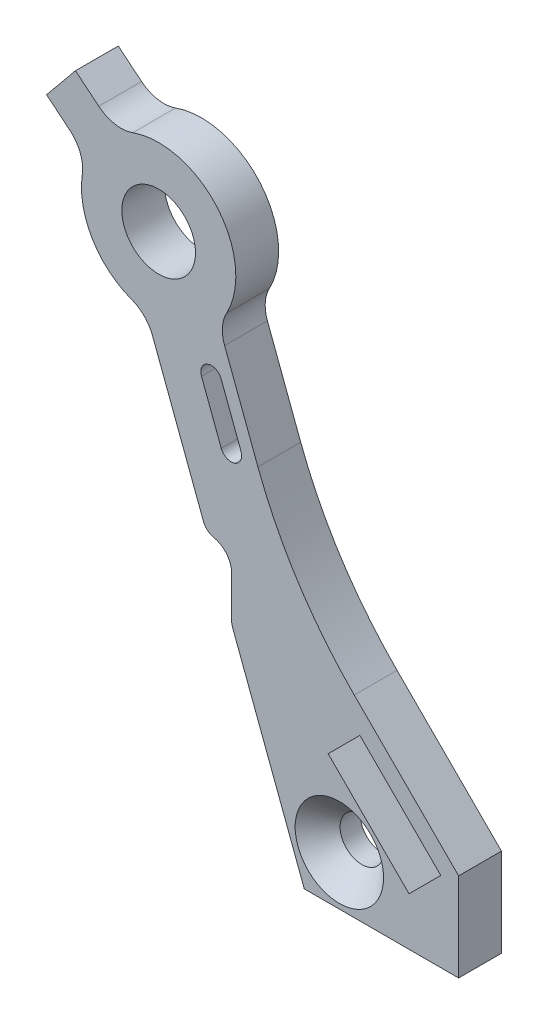
ISO-10303-21;
HEADER;
FILE_DESCRIPTION(('STEP AP214'),'2;1');
FILE_NAME('part.step','',(''),(''),'','','');
FILE_SCHEMA(('AUTOMOTIVE_DESIGN { 1 0 10303 214 1 1 1 1 }'));
ENDSEC;
DATA;
#1=APPLICATION_CONTEXT('core data for automotive mechanical design processes');
#2=APPLICATION_PROTOCOL_DEFINITION('international standard','automotive_design',2000,#1);
#3=PRODUCT_CONTEXT('',#1,'mechanical');
#4=PRODUCT('Part','Part','',(#3));
#5=PRODUCT_RELATED_PRODUCT_CATEGORY('part','',(#4));
#6=PRODUCT_DEFINITION_FORMATION('','',#4);
#7=PRODUCT_DEFINITION_CONTEXT('part definition',#1,'design');
#8=PRODUCT_DEFINITION('design','',#6,#7);
#9=PRODUCT_DEFINITION_SHAPE('','',#8);
#10=(LENGTH_UNIT() NAMED_UNIT(*) SI_UNIT(.MILLI.,.METRE.));
#11=(NAMED_UNIT(*) PLANE_ANGLE_UNIT() SI_UNIT($,.RADIAN.));
#12=(NAMED_UNIT(*) SI_UNIT($,.STERADIAN.) SOLID_ANGLE_UNIT());
#13=UNCERTAINTY_MEASURE_WITH_UNIT(LENGTH_MEASURE(1.E-05),#10,'distance_accuracy_value','');
#14=(GEOMETRIC_REPRESENTATION_CONTEXT(3) GLOBAL_UNCERTAINTY_ASSIGNED_CONTEXT((#13)) GLOBAL_UNIT_ASSIGNED_CONTEXT((#10,
#11,#12)) REPRESENTATION_CONTEXT('',''));
#15=CARTESIAN_POINT('',(0.,0.,0.));
#16=DIRECTION('',(0.,0.,1.));
#17=DIRECTION('',(1.,0.,0.));
#18=AXIS2_PLACEMENT_3D('',#15,#16,#17);
#19=CARTESIAN_POINT('',(4.21153120532065,1.58524600823039,3.05));
#20=DIRECTION('',(-0.935895823404589,-0.352276890717865,0.));
#21=DIRECTION('',(0.352276890717865,-0.935895823404589,0.));
#22=AXIS2_PLACEMENT_3D('',#19,#20,#21);
#23=PLANE('',#22);
#24=DIRECTION('',(-0.352276890717865,0.935895823404589,0.));
#25=VECTOR('',#24,1.);
#26=CARTESIAN_POINT('',(4.21153120532065,1.58524600823039,0.));
#27=LINE('',#26,#25);
#28=CARTESIAN_POINT('',(-4.51071856128028,24.7576917244929,0.));
#29=VERTEX_POINT('',#28);
#30=CARTESIAN_POINT('',(-5.91982612415175,28.5012750181112,0.));
#31=VERTEX_POINT('',#30);
#32=EDGE_CURVE('E421',#29,#31,#27,.T.);
#33=ORIENTED_EDGE('',*,*,#32,.F.);
#34=DIRECTION('',(0.,0.,-1.));
#35=VECTOR('',#34,1.);
#36=CARTESIAN_POINT('',(-4.51071856128028,24.7576917244929,3.05));
#37=LINE('',#36,#35);
#38=CARTESIAN_POINT('',(-4.51071856128028,24.7576917244929,3.05));
#39=VERTEX_POINT('',#38);
#40=EDGE_CURVE('E492',#29,#39,#37,.F.);
#41=ORIENTED_EDGE('',*,*,#40,.T.);
#42=DIRECTION('',(-0.352276890717865,0.935895823404589,0.));
#43=VECTOR('',#42,1.);
#44=CARTESIAN_POINT('',(4.21153120532065,1.58524600823039,3.05));
#45=LINE('',#44,#43);
#46=CARTESIAN_POINT('',(-5.91982612415175,28.5012750181112,3.05));
#47=VERTEX_POINT('',#46);
#48=EDGE_CURVE('E324',#39,#47,#45,.T.);
#49=ORIENTED_EDGE('',*,*,#48,.T.);
#50=DIRECTION('',(0.,0.,-1.));
#51=VECTOR('',#50,1.);
#52=CARTESIAN_POINT('',(-5.91982612415175,28.5012750181112,0.));
#53=LINE('',#52,#51);
#54=EDGE_CURVE('E499',#47,#31,#53,.T.);
#55=ORIENTED_EDGE('',*,*,#54,.T.);
#56=EDGE_LOOP('',(#33,#41,#49,#55));
#57=FACE_BOUND('',#56,.T.);
#58=ADVANCED_FACE('F52',(#57),#23,.T.);
#59=CARTESIAN_POINT('',(7.70970869120796,7.70970869120796,3.05));
#60=DIRECTION('',(0.707106781186548,0.707106781186547,0.));
#61=DIRECTION('',(-0.707106781186547,0.707106781186548,0.));
#62=AXIS2_PLACEMENT_3D('',#59,#60,#61);
#63=PLANE('',#62);
#64=DIRECTION('',(0.707106781186547,-0.707106781186548,0.));
#65=VECTOR('',#64,1.);
#66=CARTESIAN_POINT('',(7.70970869120796,7.70970869120796,0.));
#67=LINE('',#66,#65);
#68=CARTESIAN_POINT('',(3.96428752719385,11.4551298552221,0.));
#69=VERTEX_POINT('',#68);
#70=CARTESIAN_POINT('',(9.72720779386421,5.6922095885517,0.));
#71=VERTEX_POINT('',#70);
#72=EDGE_CURVE('E400',#69,#71,#67,.T.);
#73=ORIENTED_EDGE('',*,*,#72,.T.);
#74=DIRECTION('',(0.,0.,-1.));
#75=VECTOR('',#74,1.);
#76=CARTESIAN_POINT('',(9.72720779386421,5.6922095885517,3.05));
#77=LINE('',#76,#75);
#78=CARTESIAN_POINT('',(9.72720779386421,5.6922095885517,3.05));
#79=VERTEX_POINT('',#78);
#80=EDGE_CURVE('E648',#79,#71,#77,.T.);
#81=ORIENTED_EDGE('',*,*,#80,.F.);
#82=DIRECTION('',(0.707106781186547,-0.707106781186548,0.));
#83=VECTOR('',#82,1.);
#84=CARTESIAN_POINT('',(7.70970869120796,7.70970869120796,3.05));
#85=LINE('',#84,#83);
#86=CARTESIAN_POINT('',(3.96428752719385,11.4551298552221,3.05));
#87=VERTEX_POINT('',#86);
#88=EDGE_CURVE('E311',#87,#79,#85,.T.);
#89=ORIENTED_EDGE('',*,*,#88,.F.);
#90=DIRECTION('',(0.,0.,-1.));
#91=VECTOR('',#90,1.);
#92=CARTESIAN_POINT('',(3.96428752719385,11.4551298552221,3.05));
#93=LINE('',#92,#91);
#94=EDGE_CURVE('E264',#87,#69,#93,.T.);
#95=ORIENTED_EDGE('',*,*,#94,.T.);
#96=EDGE_LOOP('',(#73,#81,#89,#95));
#97=FACE_BOUND('',#96,.T.);
#98=ADVANCED_FACE('F646',(#97),#63,.F.);
#99=CARTESIAN_POINT('',(2.01749910265625,-2.01749910265625,3.05));
#100=DIRECTION('',(-0.707106781186547,0.707106781186548,0.));
#101=DIRECTION('',(-0.707106781186548,-0.707106781186547,0.));
#102=AXIS2_PLACEMENT_3D('',#99,#100,#101);
#103=PLANE('',#102);
#104=DIRECTION('',(0.707106781186548,0.707106781186547,0.));
#105=VECTOR('',#104,1.);
#106=CARTESIAN_POINT('',(2.01749910265625,-2.01749910265625,0.));
#107=LINE('',#106,#105);
#108=CARTESIAN_POINT('',(7.46446609406726,3.42946788875475,0.));
#109=VERTEX_POINT('',#108);
#110=EDGE_CURVE('E408',#109,#71,#107,.T.);
#111=ORIENTED_EDGE('',*,*,#110,.F.);
#112=DIRECTION('',(0.,0.,-1.));
#113=VECTOR('',#112,1.);
#114=CARTESIAN_POINT('',(7.46446609406726,3.42946788875475,3.05));
#115=LINE('',#114,#113);
#116=CARTESIAN_POINT('',(7.46446609406726,3.42946788875475,3.05));
#117=VERTEX_POINT('',#116);
#118=EDGE_CURVE('E656',#117,#109,#115,.T.);
#119=ORIENTED_EDGE('',*,*,#118,.F.);
#120=DIRECTION('',(0.707106781186548,0.707106781186547,0.));
#121=VECTOR('',#120,1.);
#122=CARTESIAN_POINT('',(2.01749910265625,-2.01749910265625,3.05));
#123=LINE('',#122,#121);
#124=EDGE_CURVE('E314',#117,#79,#123,.T.);
#125=ORIENTED_EDGE('',*,*,#124,.T.);
#126=ORIENTED_EDGE('',*,*,#80,.T.);
#127=EDGE_LOOP('',(#111,#119,#125,#126));
#128=FACE_BOUND('',#127,.T.);
#129=ADVANCED_FACE('F746',(#128),#103,.T.);
#130=CARTESIAN_POINT('',(5.44696699141101,5.44696699141101,3.05));
#131=DIRECTION('',(-0.707106781186548,-0.707106781186548,0.));
#132=DIRECTION('',(0.707106781186548,-0.707106781186548,0.));
#133=AXIS2_PLACEMENT_3D('',#130,#131,#132);
#134=PLANE('',#133);
#135=DIRECTION('',(-0.707106781186548,0.707106781186548,0.));
#136=VECTOR('',#135,1.);
#137=CARTESIAN_POINT('',(5.44696699141101,5.44696699141101,0.));
#138=LINE('',#137,#136);
#139=CARTESIAN_POINT('',(1.70154582739689,9.19238815542512,0.));
#140=VERTEX_POINT('',#139);
#141=EDGE_CURVE('E422',#109,#140,#138,.T.);
#142=ORIENTED_EDGE('',*,*,#141,.T.);
#143=DIRECTION('',(0.,0.,-1.));
#144=VECTOR('',#143,1.);
#145=CARTESIAN_POINT('',(1.70154582739689,9.19238815542512,3.05));
#146=LINE('',#145,#144);
#147=CARTESIAN_POINT('',(1.70154582739689,9.19238815542512,3.05));
#148=VERTEX_POINT('',#147);
#149=EDGE_CURVE('E653',#148,#140,#146,.T.);
#150=ORIENTED_EDGE('',*,*,#149,.F.);
#151=DIRECTION('',(-0.707106781186548,0.707106781186548,0.));
#152=VECTOR('',#151,1.);
#153=CARTESIAN_POINT('',(5.44696699141101,5.44696699141101,3.05));
#154=LINE('',#153,#152);
#155=EDGE_CURVE('E318',#117,#148,#154,.T.);
#156=ORIENTED_EDGE('',*,*,#155,.F.);
#157=ORIENTED_EDGE('',*,*,#118,.T.);
#158=EDGE_LOOP('',(#142,#150,#156,#157));
#159=FACE_BOUND('',#158,.T.);
#160=ADVANCED_FACE('F755',(#159),#134,.F.);
#161=CARTESIAN_POINT('',(-10.3758589408527,35.3719570465917,3.05));
#162=DIRECTION('',(0.,0.,-1.));
#163=DIRECTION('',(-1.,0.,0.));
#164=AXIS2_PLACEMENT_3D('',#161,#162,#163);
#165=CYLINDRICAL_SURFACE('',#164,5.5);
#166=CARTESIAN_POINT('',(-10.3758589408527,35.3719570465917,0.));
#167=DIRECTION('',(0.,0.,1.));
#168=DIRECTION('',(1.,0.,0.));
#169=AXIS2_PLACEMENT_3D('',#166,#167,#168);
#170=CIRCLE('',#169,5.5);
#171=CARTESIAN_POINT('',(-5.5359145871191,32.759498692328,0.));
#172=VERTEX_POINT('',#171);
#173=CARTESIAN_POINT('',(-12.2197033977444,40.5536785384117,0.));
#174=VERTEX_POINT('',#173);
#175=EDGE_CURVE('E338',#172,#174,#170,.T.);
#176=ORIENTED_EDGE('',*,*,#175,.T.);
#177=DIRECTION('',(0.,0.,-1.));
#178=VECTOR('',#177,1.);
#179=CARTESIAN_POINT('',(-12.2197033977444,40.5536785384117,3.05));
#180=LINE('',#179,#178);
#181=CARTESIAN_POINT('',(-12.2197033977444,40.5536785384117,3.05));
#182=VERTEX_POINT('',#181);
#183=EDGE_CURVE('E556',#174,#182,#180,.F.);
#184=ORIENTED_EDGE('',*,*,#183,.T.);
#185=CARTESIAN_POINT('',(-10.3758589408527,35.3719570465917,3.05));
#186=DIRECTION('',(0.,0.,1.));
#187=DIRECTION('',(1.,0.,0.));
#188=AXIS2_PLACEMENT_3D('',#185,#186,#187);
#189=CIRCLE('',#188,5.5);
#190=CARTESIAN_POINT('',(-5.5359145871191,32.759498692328,3.05));
#191=VERTEX_POINT('',#190);
#192=EDGE_CURVE('E278',#191,#182,#189,.T.);
#193=ORIENTED_EDGE('',*,*,#192,.F.);
#194=DIRECTION('',(0.,0.,-1.));
#195=VECTOR('',#194,1.);
#196=CARTESIAN_POINT('',(-5.5359145871191,32.759498692328,3.05));
#197=LINE('',#196,#195);
#198=EDGE_CURVE('E553',#191,#172,#197,.T.);
#199=ORIENTED_EDGE('',*,*,#198,.T.);
#200=EDGE_LOOP('',(#176,#184,#193,#199));
#201=FACE_BOUND('',#200,.T.);
#202=ADVANCED_FACE('F552',(#201),#165,.T.);
#203=CARTESIAN_POINT('',(14.2012797471101,17.3053215396913,3.05));
#204=DIRECTION('',(0.634371113005199,0.773028648230158,0.));
#205=DIRECTION('',(-0.773028648230158,0.634371113005199,0.));
#206=AXIS2_PLACEMENT_3D('',#203,#204,#205);
#207=PLANE('',#206);
#208=DIRECTION('',(0.773028648230158,-0.634371113005199,0.));
#209=VECTOR('',#208,1.);
#210=CARTESIAN_POINT('',(14.2012797471101,17.3053215396913,3.05));
#211=LINE('',#210,#209);
#212=CARTESIAN_POINT('',(-16.3022637162907,42.3374686170124,3.05));
#213=VERTEX_POINT('',#212);
#214=CARTESIAN_POINT('',(-14.6437422970263,40.9764348686636,3.05));
#215=VERTEX_POINT('',#214);
#216=EDGE_CURVE('E255',#213,#215,#211,.T.);
#217=ORIENTED_EDGE('',*,*,#216,.T.);
#218=DIRECTION('',(0.,0.,-1.));
#219=VECTOR('',#218,1.);
#220=CARTESIAN_POINT('',(-14.6437422970263,40.9764348686636,3.05));
#221=LINE('',#220,#219);
#222=CARTESIAN_POINT('',(-14.6437422970263,40.9764348686636,0.));
#223=VERTEX_POINT('',#222);
#224=EDGE_CURVE('E560',#215,#223,#221,.T.);
#225=ORIENTED_EDGE('',*,*,#224,.T.);
#226=DIRECTION('',(0.773028648230158,-0.634371113005199,0.));
#227=VECTOR('',#226,1.);
#228=CARTESIAN_POINT('',(14.2012797471101,17.3053215396913,0.));
#229=LINE('',#228,#227);
#230=CARTESIAN_POINT('',(-16.3022637162907,42.3374686170124,0.));
#231=VERTEX_POINT('',#230);
#232=EDGE_CURVE('E258',#231,#223,#229,.T.);
#233=ORIENTED_EDGE('',*,*,#232,.F.);
#234=DIRECTION('',(0.,0.,-1.));
#235=VECTOR('',#234,1.);
#236=CARTESIAN_POINT('',(-16.3022637162907,42.3374686170124,3.05));
#237=LINE('',#236,#235);
#238=EDGE_CURVE('E251',#213,#231,#237,.T.);
#239=ORIENTED_EDGE('',*,*,#238,.F.);
#240=EDGE_LOOP('',(#217,#225,#233,#239));
#241=FACE_BOUND('',#240,.T.);
#242=ADVANCED_FACE('F253',(#241),#207,.T.);
#243=CARTESIAN_POINT('',(-30.5035434634008,25.032147077321,3.05));
#244=DIRECTION('',(-0.773028648230159,0.634371113005197,0.));
#245=DIRECTION('',(-0.634371113005197,-0.773028648230159,0.));
#246=AXIS2_PLACEMENT_3D('',#243,#244,#245);
#247=PLANE('',#246);
#248=DIRECTION('',(0.634371113005197,0.773028648230159,0.));
#249=VECTOR('',#248,1.);
#250=CARTESIAN_POINT('',(-30.5035434634008,25.032147077321,0.));
#251=LINE('',#250,#249);
#252=CARTESIAN_POINT('',(-18.3639698335576,39.8251255102644,0.));
#253=VERTEX_POINT('',#252);
#254=EDGE_CURVE('E595',#253,#231,#251,.T.);
#255=ORIENTED_EDGE('',*,*,#254,.F.);
#256=DIRECTION('',(0.,0.,-1.));
#257=VECTOR('',#256,1.);
#258=CARTESIAN_POINT('',(-18.3639698335576,39.8251255102644,3.05));
#259=LINE('',#258,#257);
#260=CARTESIAN_POINT('',(-18.3639698335576,39.8251255102644,3.05));
#261=VERTEX_POINT('',#260);
#262=EDGE_CURVE('E265',#261,#253,#259,.T.);
#263=ORIENTED_EDGE('',*,*,#262,.F.);
#264=DIRECTION('',(0.634371113005197,0.773028648230159,0.));
#265=VECTOR('',#264,1.);
#266=CARTESIAN_POINT('',(-30.5035434634008,25.032147077321,3.05));
#267=LINE('',#266,#265);
#268=EDGE_CURVE('E273',#261,#213,#267,.T.);
#269=ORIENTED_EDGE('',*,*,#268,.T.);
#270=ORIENTED_EDGE('',*,*,#238,.T.);
#271=EDGE_LOOP('',(#255,#263,#269,#270));
#272=FACE_BOUND('',#271,.T.);
#273=ADVANCED_FACE('F280',(#272),#247,.T.);
#274=CARTESIAN_POINT('',(12.1395736298432,14.7929784329432,3.05));
#275=DIRECTION('',(0.6343711130052,0.773028648230157,0.));
#276=DIRECTION('',(-0.773028648230157,0.6343711130052,0.));
#277=AXIS2_PLACEMENT_3D('',#274,#275,#276);
#278=PLANE('',#277);
#279=DIRECTION('',(0.773028648230157,-0.6343711130052,0.));
#280=VECTOR('',#279,1.);
#281=CARTESIAN_POINT('',(12.1395736298432,14.7929784329432,0.));
#282=LINE('',#281,#280);
#283=CARTESIAN_POINT('',(-16.7054484142932,38.4640917619156,0.));
#284=VERTEX_POINT('',#283);
#285=EDGE_CURVE('E357',#253,#284,#282,.T.);
#286=ORIENTED_EDGE('',*,*,#285,.T.);
#287=DIRECTION('',(0.,0.,1.));
#288=VECTOR('',#287,1.);
#289=CARTESIAN_POINT('',(-16.7054484142932,38.4640917619155,3.05));
#290=LINE('',#289,#288);
#291=CARTESIAN_POINT('',(-16.7054484142932,38.4640917619156,3.05));
#292=VERTEX_POINT('',#291);
#293=EDGE_CURVE('E576',#284,#292,#290,.T.);
#294=ORIENTED_EDGE('',*,*,#293,.T.);
#295=DIRECTION('',(0.773028648230157,-0.6343711130052,0.));
#296=VECTOR('',#295,1.);
#297=CARTESIAN_POINT('',(12.1395736298432,14.7929784329432,3.05));
#298=LINE('',#297,#296);
#299=EDGE_CURVE('E283',#261,#292,#298,.T.);
#300=ORIENTED_EDGE('',*,*,#299,.F.);
#301=ORIENTED_EDGE('',*,*,#262,.T.);
#302=EDGE_LOOP('',(#286,#294,#300,#301));
#303=FACE_BOUND('',#302,.T.);
#304=ADVANCED_FACE('F626',(#303),#278,.F.);
#305=CARTESIAN_POINT('',(-15.8177770543207,36.1691566742313,3.05));
#306=VERTEX_POINT('',#305);
#307=CARTESIAN_POINT('',(-12.291912562321,30.2164998874584,3.05));
#308=VERTEX_POINT('',#307);
#309=EDGE_CURVE('E286',#306,#308,#189,.T.);
#310=ORIENTED_EDGE('',*,*,#309,.F.);
#311=DIRECTION('',(0.,0.,-1.));
#312=VECTOR('',#311,1.);
#313=CARTESIAN_POINT('',(-15.8177770543207,36.1691566742313,3.05));
#314=LINE('',#313,#312);
#315=CARTESIAN_POINT('',(-15.8177770543207,36.1691566742313,0.));
#316=VERTEX_POINT('',#315);
#317=EDGE_CURVE('E572',#306,#316,#314,.T.);
#318=ORIENTED_EDGE('',*,*,#317,.T.);
#319=CARTESIAN_POINT('',(-12.291912562321,30.2164998874584,0.));
#320=VERTEX_POINT('',#319);
#321=EDGE_CURVE('E340',#316,#320,#170,.T.);
#322=ORIENTED_EDGE('',*,*,#321,.T.);
#323=DIRECTION('',(0.,0.,-1.));
#324=VECTOR('',#323,1.);
#325=CARTESIAN_POINT('',(-12.291912562321,30.2164998874584,3.05));
#326=LINE('',#325,#324);
#327=EDGE_CURVE('E564',#320,#308,#326,.F.);
#328=ORIENTED_EDGE('',*,*,#327,.T.);
#329=EDGE_LOOP('',(#310,#318,#322,#328));
#330=FACE_BOUND('',#329,.T.);
#331=ADVANCED_FACE('F623',(#330),#165,.T.);
#332=CARTESIAN_POINT('',(0.,0.,3.05));
#333=DIRECTION('',(-0.935895823404589,-0.352276890717865,0.));
#334=DIRECTION('',(0.352276890717865,-0.935895823404589,0.));
#335=AXIS2_PLACEMENT_3D('',#332,#333,#334);
#336=PLANE('',#335);
#337=DIRECTION('',(-0.352276890717865,0.935895823404589,0.));
#338=VECTOR('',#337,1.);
#339=CARTESIAN_POINT('',(0.,0.,0.));
#340=LINE('',#339,#338);
#341=CARTESIAN_POINT('',(-7.18457053858644,19.0872854200473,0.));
#342=VERTEX_POINT('',#341);
#343=CARTESIAN_POINT('',(-10.8231064681132,28.7538024964652,0.));
#344=VERTEX_POINT('',#343);
#345=EDGE_CURVE('E351',#342,#344,#340,.T.);
#346=ORIENTED_EDGE('',*,*,#345,.F.);
#347=DIRECTION('',(0.,0.,-1.));
#348=VECTOR('',#347,1.);
#349=CARTESIAN_POINT('',(-7.18457053858644,19.0872854200473,3.05));
#350=LINE('',#349,#348);
#351=CARTESIAN_POINT('',(-7.18457053858644,19.0872854200473,3.05));
#352=VERTEX_POINT('',#351);
#353=EDGE_CURVE('E502',#342,#352,#350,.F.);
#354=ORIENTED_EDGE('',*,*,#353,.T.);
#355=DIRECTION('',(-0.352276890717865,0.935895823404589,0.));
#356=VECTOR('',#355,1.);
#357=CARTESIAN_POINT('',(0.,0.,3.05));
#358=LINE('',#357,#356);
#359=CARTESIAN_POINT('',(-10.8231064681132,28.7538024964652,3.05));
#360=VERTEX_POINT('',#359);
#361=EDGE_CURVE('E290',#352,#360,#358,.T.);
#362=ORIENTED_EDGE('',*,*,#361,.T.);
#363=DIRECTION('',(0.,0.,-1.));
#364=VECTOR('',#363,1.);
#365=CARTESIAN_POINT('',(-10.8231064681132,28.7538024964652,3.05));
#366=LINE('',#365,#364);
#367=EDGE_CURVE('E579',#360,#344,#366,.T.);
#368=ORIENTED_EDGE('',*,*,#367,.T.);
#369=EDGE_LOOP('',(#346,#354,#362,#368));
#370=FACE_BOUND('',#369,.T.);
#371=ADVANCED_FACE('F773',(#370),#336,.T.);
#372=CARTESIAN_POINT('',(-5.1729363693577,0.,3.05));
#373=DIRECTION('',(1.,0.,0.));
#374=DIRECTION('',(0.,1.,0.));
#375=AXIS2_PLACEMENT_3D('',#372,#373,#374);
#376=PLANE('',#375);
#377=DIRECTION('',(0.,-1.,0.));
#378=VECTOR('',#377,1.);
#379=CARTESIAN_POINT('',(-5.1729363693577,0.,0.));
#380=LINE('',#379,#378);
#381=CARTESIAN_POINT('',(-5.17293636935771,16.8929665992395,0.));
#382=VERTEX_POINT('',#381);
#383=CARTESIAN_POINT('',(-5.17293636935771,13.9249375950229,0.));
#384=VERTEX_POINT('',#383);
#385=EDGE_CURVE('E355',#382,#384,#380,.T.);
#386=ORIENTED_EDGE('',*,*,#385,.T.);
#387=DIRECTION('',(0.,0.,-1.));
#388=VECTOR('',#387,1.);
#389=CARTESIAN_POINT('',(-5.17293636935771,13.9249375950229,3.05));
#390=LINE('',#389,#388);
#391=CARTESIAN_POINT('',(-5.17293636935771,13.9249375950229,3.05));
#392=VERTEX_POINT('',#391);
#393=EDGE_CURVE('E515',#384,#392,#390,.F.);
#394=ORIENTED_EDGE('',*,*,#393,.T.);
#395=DIRECTION('',(0.,-1.,0.));
#396=VECTOR('',#395,1.);
#397=CARTESIAN_POINT('',(-5.1729363693577,0.,3.05));
#398=LINE('',#397,#396);
#399=CARTESIAN_POINT('',(-5.17293636935771,16.8929665992395,3.05));
#400=VERTEX_POINT('',#399);
#401=EDGE_CURVE('E293',#400,#392,#398,.T.);
#402=ORIENTED_EDGE('',*,*,#401,.F.);
#403=DIRECTION('',(0.,0.,-1.));
#404=VECTOR('',#403,1.);
#405=CARTESIAN_POINT('',(-5.17293636935771,16.8929665992395,0.));
#406=LINE('',#405,#404);
#407=EDGE_CURVE('E663',#400,#382,#406,.T.);
#408=ORIENTED_EDGE('',*,*,#407,.T.);
#409=EDGE_LOOP('',(#386,#394,#402,#408));
#410=FACE_BOUND('',#409,.T.);
#411=ADVANCED_FACE('F689',(#410),#376,.F.);
#412=CARTESIAN_POINT('',(0.,0.,3.05));
#413=VERTEX_POINT('',#412);
#414=CARTESIAN_POINT('',(-5.10883219276229,13.5726607043051,3.05));
#415=VERTEX_POINT('',#414);
#416=EDGE_CURVE('E294',#413,#415,#358,.T.);
#417=ORIENTED_EDGE('',*,*,#416,.T.);
#418=DIRECTION('',(0.,0.,-1.));
#419=VECTOR('',#418,1.);
#420=CARTESIAN_POINT('',(-5.1088321927623,13.5726607043051,0.));
#421=LINE('',#420,#419);
#422=CARTESIAN_POINT('',(-5.10883219276229,13.5726607043051,0.));
#423=VERTEX_POINT('',#422);
#424=EDGE_CURVE('E524',#415,#423,#421,.T.);
#425=ORIENTED_EDGE('',*,*,#424,.T.);
#426=CARTESIAN_POINT('',(0.,0.,0.));
#427=VERTEX_POINT('',#426);
#428=EDGE_CURVE('E356',#427,#423,#340,.T.);
#429=ORIENTED_EDGE('',*,*,#428,.F.);
#430=DIRECTION('',(0.,0.,-1.));
#431=VECTOR('',#430,1.);
#432=CARTESIAN_POINT('',(0.,0.,3.05));
#433=LINE('',#432,#431);
#434=EDGE_CURVE('E628',#413,#427,#433,.T.);
#435=ORIENTED_EDGE('',*,*,#434,.F.);
#436=EDGE_LOOP('',(#417,#425,#429,#435));
#437=FACE_BOUND('',#436,.T.);
#438=ADVANCED_FACE('F724',(#437),#336,.T.);
#439=CARTESIAN_POINT('',(0.,0.,3.05));
#440=DIRECTION('',(0.,1.,0.));
#441=DIRECTION('',(-1.,0.,0.));
#442=AXIS2_PLACEMENT_3D('',#439,#440,#441);
#443=PLANE('',#442);
#444=DIRECTION('',(1.,0.,0.));
#445=VECTOR('',#444,1.);
#446=CARTESIAN_POINT('',(0.,0.,0.));
#447=LINE('',#446,#445);
#448=CARTESIAN_POINT('',(11.,0.,0.));
#449=VERTEX_POINT('',#448);
#450=EDGE_CURVE('E696',#427,#449,#447,.T.);
#451=ORIENTED_EDGE('',*,*,#450,.T.);
#452=DIRECTION('',(0.,0.,-1.));
#453=VECTOR('',#452,1.);
#454=CARTESIAN_POINT('',(11.,0.,3.05));
#455=LINE('',#454,#453);
#456=CARTESIAN_POINT('',(11.,0.,3.05));
#457=VERTEX_POINT('',#456);
#458=EDGE_CURVE('E667',#457,#449,#455,.T.);
#459=ORIENTED_EDGE('',*,*,#458,.F.);
#460=DIRECTION('',(1.,0.,0.));
#461=VECTOR('',#460,1.);
#462=CARTESIAN_POINT('',(0.,0.,3.05));
#463=LINE('',#462,#461);
#464=EDGE_CURVE('E297',#413,#457,#463,.T.);
#465=ORIENTED_EDGE('',*,*,#464,.F.);
#466=ORIENTED_EDGE('',*,*,#434,.T.);
#467=EDGE_LOOP('',(#451,#459,#465,#466));
#468=FACE_BOUND('',#467,.T.);
#469=ADVANCED_FACE('F718',(#468),#443,.F.);
#470=CARTESIAN_POINT('',(11.,0.,3.05));
#471=DIRECTION('',(1.,0.,0.));
#472=DIRECTION('',(0.,0.,-1.));
#473=AXIS2_PLACEMENT_3D('',#470,#471,#472);
#474=PLANE('',#473);
#475=DIRECTION('',(0.,-1.,0.));
#476=VECTOR('',#475,1.);
#477=CARTESIAN_POINT('',(11.,0.,0.));
#478=LINE('',#477,#476);
#479=CARTESIAN_POINT('',(11.,6.3039086153561,0.));
#480=VERTEX_POINT('',#479);
#481=EDGE_CURVE('E699',#480,#449,#478,.T.);
#482=ORIENTED_EDGE('',*,*,#481,.F.);
#483=DIRECTION('',(0.,0.,-1.));
#484=VECTOR('',#483,1.);
#485=CARTESIAN_POINT('',(11.,6.3039086153561,3.05));
#486=LINE('',#485,#484);
#487=CARTESIAN_POINT('',(11.,6.3039086153561,3.05));
#488=VERTEX_POINT('',#487);
#489=EDGE_CURVE('E332',#488,#480,#486,.T.);
#490=ORIENTED_EDGE('',*,*,#489,.F.);
#491=DIRECTION('',(0.,-1.,0.));
#492=VECTOR('',#491,1.);
#493=CARTESIAN_POINT('',(11.,0.,3.05));
#494=LINE('',#493,#492);
#495=EDGE_CURVE('E300',#488,#457,#494,.T.);
#496=ORIENTED_EDGE('',*,*,#495,.T.);
#497=ORIENTED_EDGE('',*,*,#458,.T.);
#498=EDGE_LOOP('',(#482,#490,#496,#497));
#499=FACE_BOUND('',#498,.T.);
#500=ADVANCED_FACE('F716',(#499),#474,.T.);
#501=CARTESIAN_POINT('',(8.65195430767805,8.65195430767805,3.05));
#502=DIRECTION('',(0.707106781186547,0.707106781186548,0.));
#503=DIRECTION('',(-0.707106781186548,0.707106781186547,0.));
#504=AXIS2_PLACEMENT_3D('',#501,#502,#503);
#505=PLANE('',#504);
#506=DIRECTION('',(0.707106781186548,-0.707106781186547,0.));
#507=VECTOR('',#506,1.);
#508=CARTESIAN_POINT('',(8.65195430767805,8.65195430767805,0.));
#509=LINE('',#508,#507);
#510=CARTESIAN_POINT('',(3.56047913196739,13.7434294833887,0.));
#511=VERTEX_POINT('',#510);
#512=EDGE_CURVE('E401',#511,#480,#509,.T.);
#513=ORIENTED_EDGE('',*,*,#512,.F.);
#514=DIRECTION('',(0.,0.,-1.));
#515=VECTOR('',#514,1.);
#516=CARTESIAN_POINT('',(3.56047913196739,13.7434294833887,3.05));
#517=LINE('',#516,#515);
#518=CARTESIAN_POINT('',(3.56047913196739,13.7434294833887,3.05));
#519=VERTEX_POINT('',#518);
#520=EDGE_CURVE('E534',#511,#519,#517,.F.);
#521=ORIENTED_EDGE('',*,*,#520,.T.);
#522=DIRECTION('',(0.707106781186548,-0.707106781186547,0.));
#523=VECTOR('',#522,1.);
#524=CARTESIAN_POINT('',(8.65195430767805,8.65195430767805,3.05));
#525=LINE('',#524,#523);
#526=EDGE_CURVE('E304',#519,#488,#525,.T.);
#527=ORIENTED_EDGE('',*,*,#526,.T.);
#528=ORIENTED_EDGE('',*,*,#489,.T.);
#529=EDGE_LOOP('',(#513,#521,#527,#528));
#530=FACE_BOUND('',#529,.T.);
#531=ADVANCED_FACE('F712',(#530),#505,.T.);
#532=CARTESIAN_POINT('',(-3.74542116401411,3.74542116401412,3.05));
#533=DIRECTION('',(-0.707106781186547,0.707106781186548,0.));
#534=DIRECTION('',(-0.707106781186548,-0.707106781186547,0.));
#535=AXIS2_PLACEMENT_3D('',#532,#533,#534);
#536=PLANE('',#535);
#537=DIRECTION('',(0.707106781186548,0.707106781186547,0.));
#538=VECTOR('',#537,1.);
#539=CARTESIAN_POINT('',(-3.74542116401411,3.74542116401412,0.));
#540=LINE('',#539,#538);
#541=EDGE_CURVE('E418',#140,#69,#540,.T.);
#542=ORIENTED_EDGE('',*,*,#541,.T.);
#543=ORIENTED_EDGE('',*,*,#94,.F.);
#544=DIRECTION('',(0.707106781186548,0.707106781186547,0.));
#545=VECTOR('',#544,1.);
#546=CARTESIAN_POINT('',(-3.74542116401411,3.74542116401412,3.05));
#547=LINE('',#546,#545);
#548=EDGE_CURVE('E321',#148,#87,#547,.T.);
#549=ORIENTED_EDGE('',*,*,#548,.F.);
#550=ORIENTED_EDGE('',*,*,#149,.T.);
#551=EDGE_LOOP('',(#542,#543,#549,#550));
#552=FACE_BOUND('',#551,.T.);
#553=ADVANCED_FACE('F751',(#552),#536,.F.);
#554=CARTESIAN_POINT('',(5.14742702872499,1.93752289894812,3.05));
#555=DIRECTION('',(0.935895823404592,0.352276890717858,0.));
#556=DIRECTION('',(-0.352276890717858,0.935895823404592,0.));
#557=AXIS2_PLACEMENT_3D('',#554,#555,#556);
#558=PLANE('',#557);
#559=DIRECTION('',(0.352276890717858,-0.935895823404592,0.));
#560=VECTOR('',#559,1.);
#561=CARTESIAN_POINT('',(5.14742702872499,1.93752289894812,3.05));
#562=LINE('',#561,#560);
#563=CARTESIAN_POINT('',(-5.67567943938804,30.6913253954135,3.05));
#564=VERTEX_POINT('',#563);
#565=CARTESIAN_POINT('',(-3.30319213457393,24.3883261974494,3.05));
#566=VERTEX_POINT('',#565);
#567=EDGE_CURVE('E307',#564,#566,#562,.T.);
#568=ORIENTED_EDGE('',*,*,#567,.T.);
#569=DIRECTION('',(0.,0.,-1.));
#570=VECTOR('',#569,1.);
#571=CARTESIAN_POINT('',(-3.30319213457393,24.3883261974494,0.));
#572=LINE('',#571,#570);
#573=CARTESIAN_POINT('',(-3.30319213457393,24.3883261974494,0.));
#574=VERTEX_POINT('',#573);
#575=EDGE_CURVE('E536',#566,#574,#572,.T.);
#576=ORIENTED_EDGE('',*,*,#575,.T.);
#577=DIRECTION('',(0.352276890717858,-0.935895823404592,0.));
#578=VECTOR('',#577,1.);
#579=CARTESIAN_POINT('',(5.14742702872499,1.93752289894812,0.));
#580=LINE('',#579,#578);
#581=CARTESIAN_POINT('',(-5.67567943938804,30.6913253954135,0.));
#582=VERTEX_POINT('',#581);
#583=EDGE_CURVE('E394',#582,#574,#580,.T.);
#584=ORIENTED_EDGE('',*,*,#583,.F.);
#585=DIRECTION('',(0.,0.,-1.));
#586=VECTOR('',#585,1.);
#587=CARTESIAN_POINT('',(-5.67567943938803,30.6913253954135,3.05));
#588=LINE('',#587,#586);
#589=EDGE_CURVE('E583',#582,#564,#588,.F.);
#590=ORIENTED_EDGE('',*,*,#589,.T.);
#591=EDGE_LOOP('',(#568,#576,#584,#590));
#592=FACE_BOUND('',#591,.T.);
#593=ADVANCED_FACE('F754',(#592),#558,.T.);
#594=CARTESIAN_POINT('',(-10.3758589408527,35.3719570465917,3.05));
#595=DIRECTION('',(0.,0.,-1.));
#596=DIRECTION('',(-1.,0.,0.));
#597=AXIS2_PLACEMENT_3D('',#594,#595,#596);
#598=CYLINDRICAL_SURFACE('',#597,2.625);
#599=CARTESIAN_POINT('',(-10.3758589408527,35.3719570465917,3.05));
#600=DIRECTION('',(0.,0.,1.));
#601=DIRECTION('',(1.,0.,0.));
#602=AXIS2_PLACEMENT_3D('',#599,#600,#601);
#603=CIRCLE('',#602,2.625);
#604=CARTESIAN_POINT('',(-7.7508589408527,35.3719570465917,3.05));
#605=VERTEX_POINT('',#604);
#606=EDGE_CURVE('E432',#605,#605,#603,.T.);
#607=ORIENTED_EDGE('',*,*,#606,.T.);
#608=EDGE_LOOP('',(#607));
#609=FACE_BOUND('',#608,.T.);
#610=CARTESIAN_POINT('',(-10.3758589408527,35.3719570465917,0.));
#611=DIRECTION('',(0.,0.,1.));
#612=DIRECTION('',(1.,0.,0.));
#613=AXIS2_PLACEMENT_3D('',#610,#611,#612);
#614=CIRCLE('',#613,2.625);
#615=CARTESIAN_POINT('',(-7.7508589408527,35.3719570465917,0.));
#616=VERTEX_POINT('',#615);
#617=EDGE_CURVE('E333',#616,#616,#614,.T.);
#618=ORIENTED_EDGE('',*,*,#617,.F.);
#619=EDGE_LOOP('',(#618));
#620=FACE_BOUND('',#619,.T.);
#621=ADVANCED_FACE('F764',(#609,#620),#598,.F.);
#622=CARTESIAN_POINT('',(2.80768747021377,1.0568306721536,3.05));
#623=DIRECTION('',(0.935895823404589,0.352276890717866,0.));
#624=DIRECTION('',(-0.352276890717866,0.935895823404589,0.));
#625=AXIS2_PLACEMENT_3D('',#622,#623,#624);
#626=PLANE('',#625);
#627=DIRECTION('',(0.352276890717866,-0.935895823404589,0.));
#628=VECTOR('',#627,1.);
#629=CARTESIAN_POINT('',(2.80768747021377,1.0568306721536,3.05));
#630=LINE('',#629,#628);
#631=CARTESIAN_POINT('',(-7.32366985925864,27.9728596820344,3.05));
#632=VERTEX_POINT('',#631);
#633=CARTESIAN_POINT('',(-5.91456229638717,24.2292763884161,3.05));
#634=VERTEX_POINT('',#633);
#635=EDGE_CURVE('E328',#632,#634,#630,.T.);
#636=ORIENTED_EDGE('',*,*,#635,.T.);
#637=DIRECTION('',(0.,0.,-1.));
#638=VECTOR('',#637,1.);
#639=CARTESIAN_POINT('',(-5.91456229638717,24.2292763884161,0.));
#640=LINE('',#639,#638);
#641=CARTESIAN_POINT('',(-5.91456229638717,24.2292763884161,0.));
#642=VERTEX_POINT('',#641);
#643=EDGE_CURVE('E484',#634,#642,#640,.T.);
#644=ORIENTED_EDGE('',*,*,#643,.T.);
#645=DIRECTION('',(0.352276890717866,-0.935895823404589,0.));
#646=VECTOR('',#645,1.);
#647=CARTESIAN_POINT('',(2.80768747021377,1.0568306721536,0.));
#648=LINE('',#647,#646);
#649=CARTESIAN_POINT('',(-7.32366985925864,27.9728596820344,0.));
#650=VERTEX_POINT('',#649);
#651=EDGE_CURVE('E427',#650,#642,#648,.T.);
#652=ORIENTED_EDGE('',*,*,#651,.F.);
#653=DIRECTION('',(0.,0.,-1.));
#654=VECTOR('',#653,1.);
#655=CARTESIAN_POINT('',(-7.32366985925863,27.9728596820344,3.05));
#656=LINE('',#655,#654);
#657=EDGE_CURVE('E477',#650,#632,#656,.F.);
#658=ORIENTED_EDGE('',*,*,#657,.T.);
#659=EDGE_LOOP('',(#636,#644,#652,#658));
#660=FACE_BOUND('',#659,.T.);
#661=ADVANCED_FACE('F482',(#660),#626,.T.);
#662=CARTESIAN_POINT('',(0.,0.,3.05));
#663=DIRECTION('',(0.,0.,1.));
#664=DIRECTION('',(1.,0.,0.));
#665=AXIS2_PLACEMENT_3D('',#662,#663,#664);
#666=PLANE('',#665);
#667=CARTESIAN_POINT('',(2.5,3.5,3.05));
#668=DIRECTION('',(0.,0.,1.));
#669=DIRECTION('',(1.,0.,0.));
#670=AXIS2_PLACEMENT_3D('',#667,#668,#669);
#671=CIRCLE('',#670,3.15);
#672=CARTESIAN_POINT('',(5.65,3.5,3.05));
#673=VERTEX_POINT('',#672);
#674=EDGE_CURVE('E460',#673,#673,#671,.T.);
#675=ORIENTED_EDGE('',*,*,#674,.F.);
#676=EDGE_LOOP('',(#675));
#677=FACE_BOUND('',#676,.T.);
#678=ORIENTED_EDGE('',*,*,#606,.F.);
#679=EDGE_LOOP('',(#678));
#680=FACE_BOUND('',#679,.T.);
#681=ORIENTED_EDGE('',*,*,#401,.T.);
#682=CARTESIAN_POINT('',(-4.17293636935771,13.9249375950229,3.05));
#683=DIRECTION('',(0.,0.,1.));
#684=DIRECTION('',(1.,0.,0.));
#685=AXIS2_PLACEMENT_3D('',#682,#683,#684);
#686=CIRCLE('',#685,1.);
#687=EDGE_CURVE('E509',#392,#415,#686,.T.);
#688=ORIENTED_EDGE('',*,*,#687,.T.);
#689=ORIENTED_EDGE('',*,*,#416,.F.);
#690=ORIENTED_EDGE('',*,*,#464,.T.);
#691=ORIENTED_EDGE('',*,*,#495,.F.);
#692=ORIENTED_EDGE('',*,*,#526,.F.);
#693=CARTESIAN_POINT('',(24.7736825675638,34.9566329189851,3.05));
#694=DIRECTION('',(0.,0.,1.));
#695=DIRECTION('',(1.,0.,0.));
#696=AXIS2_PLACEMENT_3D('',#693,#694,#695);
#697=CIRCLE('',#696,30.);
#698=EDGE_CURVE('E528',#519,#566,#697,.F.);
#699=ORIENTED_EDGE('',*,*,#698,.T.);
#700=ORIENTED_EDGE('',*,*,#567,.F.);
#701=CARTESIAN_POINT('',(-3.33593988087655,31.5720176222081,3.05));
#702=DIRECTION('',(0.,0.,1.));
#703=DIRECTION('',(1.,0.,0.));
#704=AXIS2_PLACEMENT_3D('',#701,#702,#703);
#705=CIRCLE('',#704,2.5);
#706=EDGE_CURVE('E384',#564,#191,#705,.F.);
#707=ORIENTED_EDGE('',*,*,#706,.T.);
#708=ORIENTED_EDGE('',*,*,#192,.T.);
#709=CARTESIAN_POINT('',(-13.0578145145133,42.909006489239,3.05));
#710=DIRECTION('',(0.,0.,1.));
#711=DIRECTION('',(1.,0.,0.));
#712=AXIS2_PLACEMENT_3D('',#709,#710,#711);
#713=CIRCLE('',#712,2.5);
#714=EDGE_CURVE('E276',#182,#215,#713,.F.);
#715=ORIENTED_EDGE('',*,*,#714,.T.);
#716=ORIENTED_EDGE('',*,*,#216,.F.);
#717=ORIENTED_EDGE('',*,*,#268,.F.);
#718=ORIENTED_EDGE('',*,*,#299,.T.);
#719=CARTESIAN_POINT('',(-18.2913761968062,36.5315201413402,3.05));
#720=DIRECTION('',(0.,0.,1.));
#721=DIRECTION('',(1.,0.,0.));
#722=AXIS2_PLACEMENT_3D('',#719,#720,#721);
#723=CIRCLE('',#722,2.5);
#724=EDGE_CURVE('E375',#292,#306,#723,.F.);
#725=ORIENTED_EDGE('',*,*,#724,.T.);
#726=ORIENTED_EDGE('',*,*,#309,.T.);
#727=CARTESIAN_POINT('',(-13.1628460266247,27.8731102696706,3.05));
#728=DIRECTION('',(0.,0.,1.));
#729=DIRECTION('',(1.,0.,0.));
#730=AXIS2_PLACEMENT_3D('',#727,#728,#729);
#731=CIRCLE('',#730,2.5);
#732=EDGE_CURVE('E374',#308,#360,#731,.F.);
#733=ORIENTED_EDGE('',*,*,#732,.T.);
#734=ORIENTED_EDGE('',*,*,#361,.F.);
#735=CARTESIAN_POINT('',(-6.24867471518186,19.4395623107652,3.05));
#736=DIRECTION('',(0.,0.,1.));
#737=DIRECTION('',(1.,0.,0.));
#738=AXIS2_PLACEMENT_3D('',#735,#736,#737);
#739=CIRCLE('',#738,1.);
#740=CARTESIAN_POINT('',(-6.4503138129418,18.4601024217168,3.05));
#741=VERTEX_POINT('',#740);
#742=EDGE_CURVE('E512',#352,#741,#739,.T.);
#743=ORIENTED_EDGE('',*,*,#742,.T.);
#744=CARTESIAN_POINT('',(-6.77293636935771,16.8929665992395,3.05));
#745=DIRECTION('',(0.,0.,1.));
#746=DIRECTION('',(1.,0.,0.));
#747=AXIS2_PLACEMENT_3D('',#744,#745,#746);
#748=CIRCLE('',#747,1.6);
#749=EDGE_CURVE('E566',#741,#400,#748,.F.);
#750=ORIENTED_EDGE('',*,*,#749,.T.);
#751=EDGE_LOOP('',(#681,#688,#689,#690,#691,#692,#699,#700,#707,#708,#715,#716,#717,#718,#725,
#726,#733,#734,#743,#750));
#752=FACE_BOUND('',#751,.T.);
#753=ORIENTED_EDGE('',*,*,#88,.T.);
#754=ORIENTED_EDGE('',*,*,#124,.F.);
#755=ORIENTED_EDGE('',*,*,#155,.T.);
#756=ORIENTED_EDGE('',*,*,#548,.T.);
#757=EDGE_LOOP('',(#753,#754,#755,#756));
#758=FACE_BOUND('',#757,.T.);
#759=ORIENTED_EDGE('',*,*,#635,.F.);
#760=CARTESIAN_POINT('',(-6.62174799170519,28.2370673500728,3.05));
#761=DIRECTION('',(0.,0.,1.));
#762=DIRECTION('',(1.,0.,0.));
#763=AXIS2_PLACEMENT_3D('',#760,#761,#762);
#764=CIRCLE('',#763,0.75);
#765=CARTESIAN_POINT('',(-6.88595565974359,28.9389892176263,3.05));
#766=VERTEX_POINT('',#765);
#767=EDGE_CURVE('E12',#632,#766,#764,.F.);
#768=ORIENTED_EDGE('',*,*,#767,.T.);
#769=CARTESIAN_POINT('',(-6.62174799170519,28.2370673500728,3.05));
#770=DIRECTION('',(0.,0.,1.));
#771=DIRECTION('',(1.,0.,0.));
#772=AXIS2_PLACEMENT_3D('',#769,#770,#771);
#773=CIRCLE('',#772,0.75);
#774=EDGE_CURVE('E453',#766,#47,#773,.F.);
#775=ORIENTED_EDGE('',*,*,#774,.T.);
#776=ORIENTED_EDGE('',*,*,#48,.F.);
#777=CARTESIAN_POINT('',(-5.21264042883372,24.4934840564545,3.05));
#778=DIRECTION('',(0.,0.,1.));
#779=DIRECTION('',(1.,0.,0.));
#780=AXIS2_PLACEMENT_3D('',#777,#778,#779);
#781=CIRCLE('',#780,0.75);
#782=CARTESIAN_POINT('',(-4.94843276079533,23.791562188901,3.05));
#783=VERTEX_POINT('',#782);
#784=EDGE_CURVE('E447',#39,#783,#781,.F.);
#785=ORIENTED_EDGE('',*,*,#784,.T.);
#786=CARTESIAN_POINT('',(-5.21264042883372,24.4934840564545,3.05));
#787=DIRECTION('',(0.,0.,1.));
#788=DIRECTION('',(1.,0.,0.));
#789=AXIS2_PLACEMENT_3D('',#786,#787,#788);
#790=CIRCLE('',#789,0.75);
#791=EDGE_CURVE('E446',#783,#634,#790,.F.);
#792=ORIENTED_EDGE('',*,*,#791,.T.);
#793=EDGE_LOOP('',(#759,#768,#775,#776,#785,#792));
#794=FACE_BOUND('',#793,.T.);
#795=ADVANCED_FACE('F270',(#677,#680,#752,#758,#794),#666,.T.);
#796=CARTESIAN_POINT('',(0.,0.,0.));
#797=DIRECTION('',(0.,0.,1.));
#798=DIRECTION('',(1.,0.,0.));
#799=AXIS2_PLACEMENT_3D('',#796,#797,#798);
#800=PLANE('',#799);
#801=CARTESIAN_POINT('',(2.5,3.5,0.));
#802=DIRECTION('',(0.,0.,1.));
#803=DIRECTION('',(1.,0.,0.));
#804=AXIS2_PLACEMENT_3D('',#801,#802,#803);
#805=CIRCLE('',#804,1.55);
#806=CARTESIAN_POINT('',(4.05,3.5,0.));
#807=VERTEX_POINT('',#806);
#808=EDGE_CURVE('E339',#807,#807,#805,.T.);
#809=ORIENTED_EDGE('',*,*,#808,.T.);
#810=EDGE_LOOP('',(#809));
#811=FACE_BOUND('',#810,.T.);
#812=ORIENTED_EDGE('',*,*,#617,.T.);
#813=EDGE_LOOP('',(#812));
#814=FACE_BOUND('',#813,.T.);
#815=ORIENTED_EDGE('',*,*,#428,.T.);
#816=CARTESIAN_POINT('',(-4.17293636935771,13.9249375950229,0.));
#817=DIRECTION('',(0.,0.,1.));
#818=DIRECTION('',(1.,0.,0.));
#819=AXIS2_PLACEMENT_3D('',#816,#817,#818);
#820=CIRCLE('',#819,1.);
#821=EDGE_CURVE('E518',#423,#384,#820,.F.);
#822=ORIENTED_EDGE('',*,*,#821,.T.);
#823=ORIENTED_EDGE('',*,*,#385,.F.);
#824=CARTESIAN_POINT('',(-6.77293636935771,16.8929665992395,0.));
#825=DIRECTION('',(0.,0.,1.));
#826=DIRECTION('',(1.,0.,0.));
#827=AXIS2_PLACEMENT_3D('',#824,#825,#826);
#828=CIRCLE('',#827,1.6);
#829=CARTESIAN_POINT('',(-6.4503138129418,18.4601024217168,0.));
#830=VERTEX_POINT('',#829);
#831=EDGE_CURVE('E674',#382,#830,#828,.T.);
#832=ORIENTED_EDGE('',*,*,#831,.T.);
#833=CARTESIAN_POINT('',(-6.24867471518186,19.4395623107652,0.));
#834=DIRECTION('',(0.,0.,1.));
#835=DIRECTION('',(1.,0.,0.));
#836=AXIS2_PLACEMENT_3D('',#833,#834,#835);
#837=CIRCLE('',#836,1.);
#838=EDGE_CURVE('E521',#830,#342,#837,.F.);
#839=ORIENTED_EDGE('',*,*,#838,.T.);
#840=ORIENTED_EDGE('',*,*,#345,.T.);
#841=CARTESIAN_POINT('',(-13.1628460266247,27.8731102696706,0.));
#842=DIRECTION('',(0.,0.,1.));
#843=DIRECTION('',(1.,0.,0.));
#844=AXIS2_PLACEMENT_3D('',#841,#842,#843);
#845=CIRCLE('',#844,2.5);
#846=EDGE_CURVE('E369',#344,#320,#845,.T.);
#847=ORIENTED_EDGE('',*,*,#846,.T.);
#848=ORIENTED_EDGE('',*,*,#321,.F.);
#849=CARTESIAN_POINT('',(-18.2913761968062,36.5315201413402,0.));
#850=DIRECTION('',(0.,0.,1.));
#851=DIRECTION('',(1.,0.,0.));
#852=AXIS2_PLACEMENT_3D('',#849,#850,#851);
#853=CIRCLE('',#852,2.5);
#854=EDGE_CURVE('E613',#316,#284,#853,.T.);
#855=ORIENTED_EDGE('',*,*,#854,.T.);
#856=ORIENTED_EDGE('',*,*,#285,.F.);
#857=ORIENTED_EDGE('',*,*,#254,.T.);
#858=ORIENTED_EDGE('',*,*,#232,.T.);
#859=CARTESIAN_POINT('',(-13.0578145145133,42.909006489239,0.));
#860=DIRECTION('',(0.,0.,1.));
#861=DIRECTION('',(1.,0.,0.));
#862=AXIS2_PLACEMENT_3D('',#859,#860,#861);
#863=CIRCLE('',#862,2.5);
#864=EDGE_CURVE('E586',#223,#174,#863,.T.);
#865=ORIENTED_EDGE('',*,*,#864,.T.);
#866=ORIENTED_EDGE('',*,*,#175,.F.);
#867=CARTESIAN_POINT('',(-3.33593988087655,31.5720176222081,0.));
#868=DIRECTION('',(0.,0.,1.));
#869=DIRECTION('',(1.,0.,0.));
#870=AXIS2_PLACEMENT_3D('',#867,#868,#869);
#871=CIRCLE('',#870,2.5);
#872=EDGE_CURVE('E380',#172,#582,#871,.T.);
#873=ORIENTED_EDGE('',*,*,#872,.T.);
#874=ORIENTED_EDGE('',*,*,#583,.T.);
#875=CARTESIAN_POINT('',(24.7736825675638,34.9566329189851,0.));
#876=DIRECTION('',(0.,0.,1.));
#877=DIRECTION('',(1.,0.,0.));
#878=AXIS2_PLACEMENT_3D('',#875,#876,#877);
#879=CIRCLE('',#878,30.);
#880=EDGE_CURVE('E530',#574,#511,#879,.T.);
#881=ORIENTED_EDGE('',*,*,#880,.T.);
#882=ORIENTED_EDGE('',*,*,#512,.T.);
#883=ORIENTED_EDGE('',*,*,#481,.T.);
#884=ORIENTED_EDGE('',*,*,#450,.F.);
#885=EDGE_LOOP('',(#815,#822,#823,#832,#839,#840,#847,#848,#855,#856,#857,#858,#865,#866,#873,
#874,#881,#882,#883,#884));
#886=FACE_BOUND('',#885,.T.);
#887=ORIENTED_EDGE('',*,*,#72,.F.);
#888=ORIENTED_EDGE('',*,*,#541,.F.);
#889=ORIENTED_EDGE('',*,*,#141,.F.);
#890=ORIENTED_EDGE('',*,*,#110,.T.);
#891=EDGE_LOOP('',(#887,#888,#889,#890));
#892=FACE_BOUND('',#891,.T.);
#893=CARTESIAN_POINT('',(-6.62174799170519,28.2370673500728,0.));
#894=DIRECTION('',(0.,0.,1.));
#895=DIRECTION('',(1.,0.,0.));
#896=AXIS2_PLACEMENT_3D('',#893,#894,#895);
#897=CIRCLE('',#896,0.75);
#898=CARTESIAN_POINT('',(-6.88595565974359,28.9389892176263,0.));
#899=VERTEX_POINT('',#898);
#900=EDGE_CURVE('E76',#31,#899,#897,.T.);
#901=ORIENTED_EDGE('',*,*,#900,.T.);
#902=CARTESIAN_POINT('',(-6.62174799170519,28.2370673500728,0.));
#903=DIRECTION('',(0.,0.,1.));
#904=DIRECTION('',(1.,0.,0.));
#905=AXIS2_PLACEMENT_3D('',#902,#903,#904);
#906=CIRCLE('',#905,0.75);
#907=EDGE_CURVE('E62',#899,#650,#906,.T.);
#908=ORIENTED_EDGE('',*,*,#907,.T.);
#909=ORIENTED_EDGE('',*,*,#651,.T.);
#910=CARTESIAN_POINT('',(-5.21264042883372,24.4934840564545,0.));
#911=DIRECTION('',(0.,0.,1.));
#912=DIRECTION('',(1.,0.,0.));
#913=AXIS2_PLACEMENT_3D('',#910,#911,#912);
#914=CIRCLE('',#913,0.75);
#915=CARTESIAN_POINT('',(-4.94843276079533,23.791562188901,0.));
#916=VERTEX_POINT('',#915);
#917=EDGE_CURVE('E441',#642,#916,#914,.T.);
#918=ORIENTED_EDGE('',*,*,#917,.T.);
#919=CARTESIAN_POINT('',(-5.21264042883372,24.4934840564545,0.));
#920=DIRECTION('',(0.,0.,1.));
#921=DIRECTION('',(1.,0.,0.));
#922=AXIS2_PLACEMENT_3D('',#919,#920,#921);
#923=CIRCLE('',#922,0.75);
#924=EDGE_CURVE('E488',#916,#29,#923,.T.);
#925=ORIENTED_EDGE('',*,*,#924,.T.);
#926=ORIENTED_EDGE('',*,*,#32,.T.);
#927=EDGE_LOOP('',(#901,#908,#909,#918,#925,#926));
#928=FACE_BOUND('',#927,.T.);
#929=ADVANCED_FACE('F479',(#811,#814,#886,#892,#928),#800,.F.);
#930=CARTESIAN_POINT('',(2.5,3.5,3.05));
#931=DIRECTION('',(0.,0.,1.));
#932=DIRECTION('',(1.,0.,0.));
#933=AXIS2_PLACEMENT_3D('',#930,#931,#932);
#934=CYLINDRICAL_SURFACE('',#933,1.55);
#935=ORIENTED_EDGE('',*,*,#808,.F.);
#936=EDGE_LOOP('',(#935));
#937=FACE_BOUND('',#936,.T.);
#938=CARTESIAN_POINT('',(2.5,3.5,1.45));
#939=DIRECTION('',(0.,0.,1.));
#940=DIRECTION('',(1.,0.,0.));
#941=AXIS2_PLACEMENT_3D('',#938,#939,#940);
#942=CIRCLE('',#941,1.55);
#943=CARTESIAN_POINT('',(4.05,3.5,1.45));
#944=VERTEX_POINT('',#943);
#945=EDGE_CURVE('E467',#944,#944,#942,.T.);
#946=ORIENTED_EDGE('',*,*,#945,.T.);
#947=EDGE_LOOP('',(#946));
#948=FACE_BOUND('',#947,.T.);
#949=ADVANCED_FACE('F635',(#937,#948),#934,.F.);
#950=CARTESIAN_POINT('',(2.5,3.5,3.05));
#951=DIRECTION('',(0.,0.,1.));
#952=DIRECTION('',(1.,0.,0.));
#953=AXIS2_PLACEMENT_3D('',#950,#951,#952);
#954=CONICAL_SURFACE('',#953,3.15,0.785398163397448);
#955=ORIENTED_EDGE('',*,*,#945,.F.);
#956=EDGE_LOOP('',(#955));
#957=FACE_BOUND('',#956,.T.);
#958=ORIENTED_EDGE('',*,*,#674,.T.);
#959=EDGE_LOOP('',(#958));
#960=FACE_BOUND('',#959,.T.);
#961=ADVANCED_FACE('F789',(#957,#960),#954,.F.);
#962=CARTESIAN_POINT('',(-6.77293636935771,16.8929665992395,3.05));
#963=DIRECTION('',(0.,0.,1.));
#964=DIRECTION('',(1.,0.,0.));
#965=AXIS2_PLACEMENT_3D('',#962,#963,#964);
#966=CYLINDRICAL_SURFACE('',#965,1.6);
#967=ORIENTED_EDGE('',*,*,#749,.F.);
#968=DIRECTION('',(0.,0.,1.));
#969=VECTOR('',#968,1.);
#970=CARTESIAN_POINT('',(-6.4503138129418,18.4601024217168,3.05));
#971=LINE('',#970,#969);
#972=EDGE_CURVE('E505',#741,#830,#971,.F.);
#973=ORIENTED_EDGE('',*,*,#972,.T.);
#974=ORIENTED_EDGE('',*,*,#831,.F.);
#975=ORIENTED_EDGE('',*,*,#407,.F.);
#976=EDGE_LOOP('',(#967,#973,#974,#975));
#977=FACE_BOUND('',#976,.T.);
#978=ADVANCED_FACE('F692',(#977),#966,.F.);
#979=CARTESIAN_POINT('',(-13.0578145145133,42.909006489239,3.05));
#980=DIRECTION('',(0.,0.,-1.));
#981=DIRECTION('',(-1.,0.,0.));
#982=AXIS2_PLACEMENT_3D('',#979,#980,#981);
#983=CYLINDRICAL_SURFACE('',#982,2.5);
#984=ORIENTED_EDGE('',*,*,#714,.F.);
#985=ORIENTED_EDGE('',*,*,#183,.F.);
#986=ORIENTED_EDGE('',*,*,#864,.F.);
#987=ORIENTED_EDGE('',*,*,#224,.F.);
#988=EDGE_LOOP('',(#984,#985,#986,#987));
#989=FACE_BOUND('',#988,.T.);
#990=ADVANCED_FACE('F611',(#989),#983,.F.);
#991=CARTESIAN_POINT('',(-18.2913761968062,36.5315201413402,3.05));
#992=DIRECTION('',(0.,0.,-1.));
#993=DIRECTION('',(-1.,0.,0.));
#994=AXIS2_PLACEMENT_3D('',#991,#992,#993);
#995=CYLINDRICAL_SURFACE('',#994,2.5);
#996=ORIENTED_EDGE('',*,*,#724,.F.);
#997=ORIENTED_EDGE('',*,*,#293,.F.);
#998=ORIENTED_EDGE('',*,*,#854,.F.);
#999=ORIENTED_EDGE('',*,*,#317,.F.);
#1000=EDGE_LOOP('',(#996,#997,#998,#999));
#1001=FACE_BOUND('',#1000,.T.);
#1002=ADVANCED_FACE('F625',(#1001),#995,.F.);
#1003=CARTESIAN_POINT('',(-13.1628460266247,27.8731102696706,3.05));
#1004=DIRECTION('',(0.,0.,-1.));
#1005=DIRECTION('',(-1.,0.,0.));
#1006=AXIS2_PLACEMENT_3D('',#1003,#1004,#1005);
#1007=CYLINDRICAL_SURFACE('',#1006,2.5);
#1008=ORIENTED_EDGE('',*,*,#732,.F.);
#1009=ORIENTED_EDGE('',*,*,#327,.F.);
#1010=ORIENTED_EDGE('',*,*,#846,.F.);
#1011=ORIENTED_EDGE('',*,*,#367,.F.);
#1012=EDGE_LOOP('',(#1008,#1009,#1010,#1011));
#1013=FACE_BOUND('',#1012,.T.);
#1014=ADVANCED_FACE('F794',(#1013),#1007,.F.);
#1015=CARTESIAN_POINT('',(-3.33593988087655,31.5720176222081,3.05));
#1016=DIRECTION('',(0.,0.,-1.));
#1017=DIRECTION('',(-1.,0.,0.));
#1018=AXIS2_PLACEMENT_3D('',#1015,#1016,#1017);
#1019=CYLINDRICAL_SURFACE('',#1018,2.5);
#1020=ORIENTED_EDGE('',*,*,#706,.F.);
#1021=ORIENTED_EDGE('',*,*,#589,.F.);
#1022=ORIENTED_EDGE('',*,*,#872,.F.);
#1023=ORIENTED_EDGE('',*,*,#198,.F.);
#1024=EDGE_LOOP('',(#1020,#1021,#1022,#1023));
#1025=FACE_BOUND('',#1024,.T.);
#1026=ADVANCED_FACE('F558',(#1025),#1019,.F.);
#1027=CARTESIAN_POINT('',(24.7736825675638,34.9566329189851,3.05));
#1028=DIRECTION('',(0.,0.,1.));
#1029=DIRECTION('',(1.,0.,0.));
#1030=AXIS2_PLACEMENT_3D('',#1027,#1028,#1029);
#1031=CYLINDRICAL_SURFACE('',#1030,30.);
#1032=ORIENTED_EDGE('',*,*,#698,.F.);
#1033=ORIENTED_EDGE('',*,*,#520,.F.);
#1034=ORIENTED_EDGE('',*,*,#880,.F.);
#1035=ORIENTED_EDGE('',*,*,#575,.F.);
#1036=EDGE_LOOP('',(#1032,#1033,#1034,#1035));
#1037=FACE_BOUND('',#1036,.T.);
#1038=ADVANCED_FACE('F729',(#1037),#1031,.F.);
#1039=CARTESIAN_POINT('',(-4.17293636935771,13.9249375950229,3.05));
#1040=DIRECTION('',(0.,0.,1.));
#1041=DIRECTION('',(1.,0.,0.));
#1042=AXIS2_PLACEMENT_3D('',#1039,#1040,#1041);
#1043=CYLINDRICAL_SURFACE('',#1042,1.);
#1044=ORIENTED_EDGE('',*,*,#687,.F.);
#1045=ORIENTED_EDGE('',*,*,#393,.F.);
#1046=ORIENTED_EDGE('',*,*,#821,.F.);
#1047=ORIENTED_EDGE('',*,*,#424,.F.);
#1048=EDGE_LOOP('',(#1044,#1045,#1046,#1047));
#1049=FACE_BOUND('',#1048,.T.);
#1050=ADVANCED_FACE('F726',(#1049),#1043,.T.);
#1051=CARTESIAN_POINT('',(-6.24867471518186,19.4395623107652,3.05));
#1052=DIRECTION('',(0.,0.,1.));
#1053=DIRECTION('',(1.,0.,0.));
#1054=AXIS2_PLACEMENT_3D('',#1051,#1052,#1053);
#1055=CYLINDRICAL_SURFACE('',#1054,1.);
#1056=ORIENTED_EDGE('',*,*,#742,.F.);
#1057=ORIENTED_EDGE('',*,*,#353,.F.);
#1058=ORIENTED_EDGE('',*,*,#838,.F.);
#1059=ORIENTED_EDGE('',*,*,#972,.F.);
#1060=EDGE_LOOP('',(#1056,#1057,#1058,#1059));
#1061=FACE_BOUND('',#1060,.T.);
#1062=ADVANCED_FACE('F728',(#1061),#1055,.T.);
#1063=CARTESIAN_POINT('',(-5.21264042883372,24.4934840564545,3.05));
#1064=DIRECTION('',(0.,0.,1.));
#1065=DIRECTION('',(1.,0.,0.));
#1066=AXIS2_PLACEMENT_3D('',#1063,#1064,#1065);
#1067=CYLINDRICAL_SURFACE('',#1066,0.75);
#1068=ORIENTED_EDGE('',*,*,#643,.F.);
#1069=ORIENTED_EDGE('',*,*,#791,.F.);
#1070=DIRECTION('',(0.,0.,-1.));
#1071=VECTOR('',#1070,1.);
#1072=CARTESIAN_POINT('',(-4.94843276079533,23.791562188901,3.05));
#1073=LINE('',#1072,#1071);
#1074=EDGE_CURVE('E457',#916,#783,#1073,.F.);
#1075=ORIENTED_EDGE('',*,*,#1074,.F.);
#1076=ORIENTED_EDGE('',*,*,#917,.F.);
#1077=EDGE_LOOP('',(#1068,#1069,#1075,#1076));
#1078=FACE_BOUND('',#1077,.T.);
#1079=ADVANCED_FACE('F735',(#1078),#1067,.F.);
#1080=CARTESIAN_POINT('',(-5.21264042883372,24.4934840564545,3.05));
#1081=DIRECTION('',(0.,0.,1.));
#1082=DIRECTION('',(1.,0.,0.));
#1083=AXIS2_PLACEMENT_3D('',#1080,#1081,#1082);
#1084=CYLINDRICAL_SURFACE('',#1083,0.75);
#1085=ORIENTED_EDGE('',*,*,#784,.F.);
#1086=ORIENTED_EDGE('',*,*,#40,.F.);
#1087=ORIENTED_EDGE('',*,*,#924,.F.);
#1088=ORIENTED_EDGE('',*,*,#1074,.T.);
#1089=EDGE_LOOP('',(#1085,#1086,#1087,#1088));
#1090=FACE_BOUND('',#1089,.T.);
#1091=ADVANCED_FACE('F904',(#1090),#1084,.F.);
#1092=CARTESIAN_POINT('',(-6.62174799170519,28.2370673500728,3.05));
#1093=DIRECTION('',(0.,0.,1.));
#1094=DIRECTION('',(1.,0.,0.));
#1095=AXIS2_PLACEMENT_3D('',#1092,#1093,#1094);
#1096=CYLINDRICAL_SURFACE('',#1095,0.75);
#1097=DIRECTION('',(0.,0.,-1.));
#1098=VECTOR('',#1097,1.);
#1099=CARTESIAN_POINT('',(-6.88595565974359,28.9389892176263,0.));
#1100=LINE('',#1099,#1098);
#1101=EDGE_CURVE('E56',#766,#899,#1100,.T.);
#1102=ORIENTED_EDGE('',*,*,#1101,.F.);
#1103=ORIENTED_EDGE('',*,*,#767,.F.);
#1104=ORIENTED_EDGE('',*,*,#657,.F.);
#1105=ORIENTED_EDGE('',*,*,#907,.F.);
#1106=EDGE_LOOP('',(#1102,#1103,#1104,#1105));
#1107=FACE_BOUND('',#1106,.T.);
#1108=ADVANCED_FACE('F54',(#1107),#1096,.F.);
#1109=CARTESIAN_POINT('',(-6.62174799170519,28.2370673500728,3.05));
#1110=DIRECTION('',(0.,0.,1.));
#1111=DIRECTION('',(1.,0.,0.));
#1112=AXIS2_PLACEMENT_3D('',#1109,#1110,#1111);
#1113=CYLINDRICAL_SURFACE('',#1112,0.75);
#1114=ORIENTED_EDGE('',*,*,#774,.F.);
#1115=ORIENTED_EDGE('',*,*,#1101,.T.);
#1116=ORIENTED_EDGE('',*,*,#900,.F.);
#1117=ORIENTED_EDGE('',*,*,#54,.F.);
#1118=EDGE_LOOP('',(#1114,#1115,#1116,#1117));
#1119=FACE_BOUND('',#1118,.T.);
#1120=ADVANCED_FACE('F472',(#1119),#1113,.F.);
#1121=CLOSED_SHELL('',(#58,#98,#129,#160,#202,#242,#273,#304,#331,#371,#411,#438,#469,#500,#531,
#553,#593,#621,#661,#795,#929,#949,#961,#978,#990,#1002,#1014,#1026,#1038,#1050,#1062,#1079,
#1091,#1108,#1120));
#1122=MANIFOLD_SOLID_BREP('B2',#1121);
#1123=ADVANCED_BREP_SHAPE_REPRESENTATION('',(#18,#1122),#14);
#1124=SHAPE_DEFINITION_REPRESENTATION(#9,#1123);
ENDSEC;
END-ISO-10303-21;
